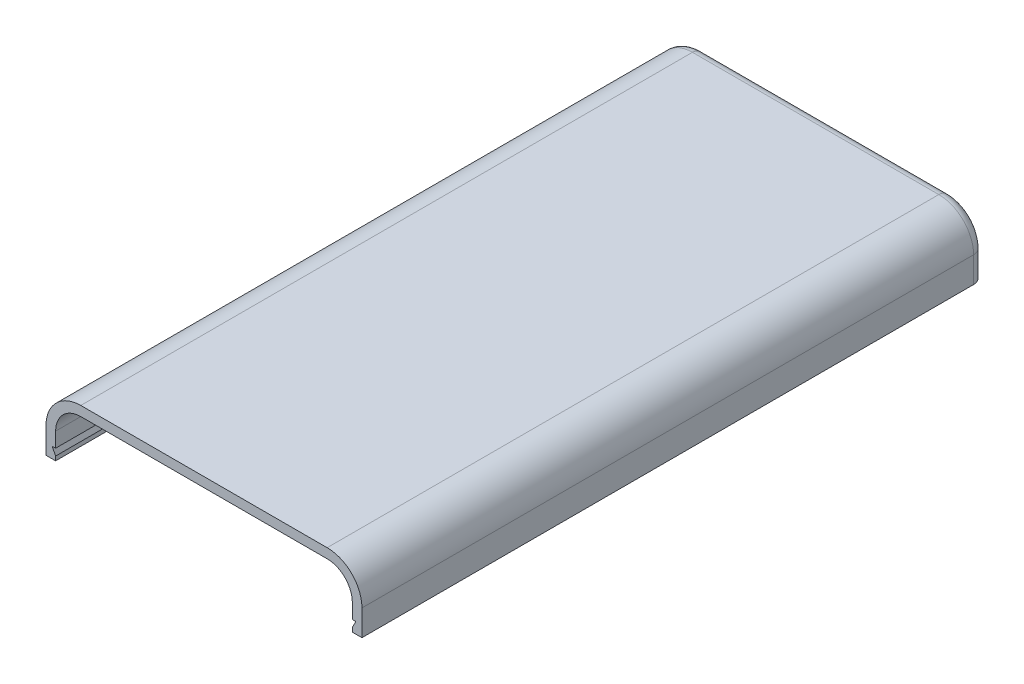
ISO-10303-21;
HEADER;
FILE_DESCRIPTION(('STEP AP214'),'2;1');
FILE_NAME('part.step','',(''),(''),'','','');
FILE_SCHEMA(('AUTOMOTIVE_DESIGN { 1 0 10303 214 1 1 1 1 }'));
ENDSEC;
DATA;
#1=APPLICATION_CONTEXT('core data for automotive mechanical design processes');
#2=APPLICATION_PROTOCOL_DEFINITION('international standard','automotive_design',2000,#1);
#3=PRODUCT_CONTEXT('',#1,'mechanical');
#4=PRODUCT('Part','Part','',(#3));
#5=PRODUCT_RELATED_PRODUCT_CATEGORY('part','',(#4));
#6=PRODUCT_DEFINITION_FORMATION('','',#4);
#7=PRODUCT_DEFINITION_CONTEXT('part definition',#1,'design');
#8=PRODUCT_DEFINITION('design','',#6,#7);
#9=PRODUCT_DEFINITION_SHAPE('','',#8);
#10=(LENGTH_UNIT() NAMED_UNIT(*) SI_UNIT(.MILLI.,.METRE.));
#11=(NAMED_UNIT(*) PLANE_ANGLE_UNIT() SI_UNIT($,.RADIAN.));
#12=(NAMED_UNIT(*) SI_UNIT($,.STERADIAN.) SOLID_ANGLE_UNIT());
#13=UNCERTAINTY_MEASURE_WITH_UNIT(LENGTH_MEASURE(1.E-05),#10,'distance_accuracy_value','');
#14=(GEOMETRIC_REPRESENTATION_CONTEXT(3) GLOBAL_UNCERTAINTY_ASSIGNED_CONTEXT((#13)) GLOBAL_UNIT_ASSIGNED_CONTEXT((#10,
#11,#12)) REPRESENTATION_CONTEXT('',''));
#15=CARTESIAN_POINT('',(0.,0.,0.));
#16=DIRECTION('',(0.,0.,1.));
#17=DIRECTION('',(1.,0.,0.));
#18=AXIS2_PLACEMENT_3D('',#15,#16,#17);
#19=CARTESIAN_POINT('',(0.,0.,116.3));
#20=DIRECTION('',(1.,0.,0.));
#21=DIRECTION('',(0.,0.,-1.));
#22=AXIS2_PLACEMENT_3D('',#19,#20,#21);
#23=PLANE('',#22);
#24=DIRECTION('',(0.,0.,-1.));
#25=VECTOR('',#24,1.);
#26=CARTESIAN_POINT('',(0.,4.81999999999995,116.3));
#27=LINE('',#26,#25);
#28=CARTESIAN_POINT('',(0.,4.81999999999995,116.3));
#29=VERTEX_POINT('',#28);
#30=CARTESIAN_POINT('',(0.,4.81999999999995,2.));
#31=VERTEX_POINT('',#30);
#32=EDGE_CURVE('E317',#29,#31,#27,.T.);
#33=ORIENTED_EDGE('',*,*,#32,.T.);
#34=DIRECTION('',(0.,-1.,0.));
#35=VECTOR('',#34,1.);
#36=CARTESIAN_POINT('',(0.,0.,2.));
#37=LINE('',#36,#35);
#38=CARTESIAN_POINT('',(0.,0.,2.));
#39=VERTEX_POINT('',#38);
#40=EDGE_CURVE('E341',#31,#39,#37,.T.);
#41=ORIENTED_EDGE('',*,*,#40,.T.);
#42=DIRECTION('',(0.,0.,-1.));
#43=VECTOR('',#42,1.);
#44=CARTESIAN_POINT('',(0.,0.,116.3));
#45=LINE('',#44,#43);
#46=CARTESIAN_POINT('',(0.,0.,116.3));
#47=VERTEX_POINT('',#46);
#48=EDGE_CURVE('E337',#47,#39,#45,.T.);
#49=ORIENTED_EDGE('',*,*,#48,.F.);
#50=DIRECTION('',(0.,-1.,0.));
#51=VECTOR('',#50,1.);
#52=CARTESIAN_POINT('',(0.,0.,116.3));
#53=LINE('',#52,#51);
#54=EDGE_CURVE('E296',#29,#47,#53,.T.);
#55=ORIENTED_EDGE('',*,*,#54,.F.);
#56=EDGE_LOOP('',(#33,#41,#49,#55));
#57=FACE_BOUND('',#56,.T.);
#58=ADVANCED_FACE('F44',(#57),#23,.F.);
#59=CARTESIAN_POINT('',(0.,0.,116.3));
#60=DIRECTION('',(0.,1.,0.));
#61=DIRECTION('',(0.,0.,1.));
#62=AXIS2_PLACEMENT_3D('',#59,#60,#61);
#63=PLANE('',#62);
#64=ORIENTED_EDGE('',*,*,#48,.T.);
#65=CARTESIAN_POINT('',(2.,0.,2.));
#66=DIRECTION('',(0.,1.,0.));
#67=DIRECTION('',(0.,0.,1.));
#68=AXIS2_PLACEMENT_3D('',#65,#66,#67);
#69=CIRCLE('',#68,2.);
#70=CARTESIAN_POINT('',(2.,0.,0.));
#71=VERTEX_POINT('',#70);
#72=EDGE_CURVE('E348',#39,#71,#69,.F.);
#73=ORIENTED_EDGE('',*,*,#72,.T.);
#74=DIRECTION('',(1.,0.,0.));
#75=VECTOR('',#74,1.);
#76=CARTESIAN_POINT('',(0.,0.,0.));
#77=LINE('',#76,#75);
#78=CARTESIAN_POINT('',(57.04,0.,0.));
#79=VERTEX_POINT('',#78);
#80=EDGE_CURVE('E295',#71,#79,#77,.T.);
#81=ORIENTED_EDGE('',*,*,#80,.T.);
#82=CARTESIAN_POINT('',(57.04,0.,2.));
#83=DIRECTION('',(0.,1.,0.));
#84=DIRECTION('',(0.,0.,1.));
#85=AXIS2_PLACEMENT_3D('',#82,#83,#84);
#86=CIRCLE('',#85,2.);
#87=CARTESIAN_POINT('',(59.04,0.,2.));
#88=VERTEX_POINT('',#87);
#89=EDGE_CURVE('E345',#79,#88,#86,.F.);
#90=ORIENTED_EDGE('',*,*,#89,.T.);
#91=DIRECTION('',(0.,0.,-1.));
#92=VECTOR('',#91,1.);
#93=CARTESIAN_POINT('',(59.04,0.,116.3));
#94=LINE('',#93,#92);
#95=CARTESIAN_POINT('',(59.04,0.,116.3));
#96=VERTEX_POINT('',#95);
#97=EDGE_CURVE('E334',#96,#88,#94,.T.);
#98=ORIENTED_EDGE('',*,*,#97,.F.);
#99=DIRECTION('',(1.,0.,0.));
#100=VECTOR('',#99,1.);
#101=CARTESIAN_POINT('',(0.,0.,116.3));
#102=LINE('',#101,#100);
#103=CARTESIAN_POINT('',(57.24,0.,116.3));
#104=VERTEX_POINT('',#103);
#105=EDGE_CURVE('E300',#104,#96,#102,.T.);
#106=ORIENTED_EDGE('',*,*,#105,.F.);
#107=DIRECTION('',(0.,0.,1.));
#108=VECTOR('',#107,1.);
#109=CARTESIAN_POINT('',(57.24,0.,-57.5429656865198));
#110=LINE('',#109,#108);
#111=CARTESIAN_POINT('',(57.24,0.,3.6));
#112=VERTEX_POINT('',#111);
#113=EDGE_CURVE('E249',#112,#104,#110,.T.);
#114=ORIENTED_EDGE('',*,*,#113,.F.);
#115=DIRECTION('',(1.,0.,0.));
#116=VECTOR('',#115,1.);
#117=CARTESIAN_POINT('',(0.,0.,3.6));
#118=LINE('',#117,#116);
#119=CARTESIAN_POINT('',(1.8,0.,3.6));
#120=VERTEX_POINT('',#119);
#121=EDGE_CURVE('E250',#120,#112,#118,.T.);
#122=ORIENTED_EDGE('',*,*,#121,.F.);
#123=DIRECTION('',(0.,0.,1.));
#124=VECTOR('',#123,1.);
#125=CARTESIAN_POINT('',(1.8,0.,-57.5429656865198));
#126=LINE('',#125,#124);
#127=CARTESIAN_POINT('',(1.8,0.,116.3));
#128=VERTEX_POINT('',#127);
#129=EDGE_CURVE('E254',#120,#128,#126,.T.);
#130=ORIENTED_EDGE('',*,*,#129,.T.);
#131=EDGE_CURVE('E301',#47,#128,#102,.T.);
#132=ORIENTED_EDGE('',*,*,#131,.F.);
#133=EDGE_LOOP('',(#64,#73,#81,#90,#98,#106,#114,#122,#130,#132));
#134=FACE_BOUND('',#133,.T.);
#135=ADVANCED_FACE('F402',(#134),#63,.F.);
#136=CARTESIAN_POINT('',(59.04,0.,116.3));
#137=DIRECTION('',(-1.,0.,0.));
#138=DIRECTION('',(0.,0.,1.));
#139=AXIS2_PLACEMENT_3D('',#136,#137,#138);
#140=PLANE('',#139);
#141=ORIENTED_EDGE('',*,*,#97,.T.);
#142=DIRECTION('',(0.,1.,0.));
#143=VECTOR('',#142,1.);
#144=CARTESIAN_POINT('',(59.04,4.81999999999995,2.));
#145=LINE('',#144,#143);
#146=CARTESIAN_POINT('',(59.04,4.81999999999995,2.));
#147=VERTEX_POINT('',#146);
#148=EDGE_CURVE('E12',#88,#147,#145,.T.);
#149=ORIENTED_EDGE('',*,*,#148,.T.);
#150=DIRECTION('',(0.,0.,-1.));
#151=VECTOR('',#150,1.);
#152=CARTESIAN_POINT('',(59.04,4.81999999999995,116.3));
#153=LINE('',#152,#151);
#154=CARTESIAN_POINT('',(59.04,4.81999999999995,116.3));
#155=VERTEX_POINT('',#154);
#156=EDGE_CURVE('E331',#155,#147,#153,.T.);
#157=ORIENTED_EDGE('',*,*,#156,.F.);
#158=DIRECTION('',(0.,1.,0.));
#159=VECTOR('',#158,1.);
#160=CARTESIAN_POINT('',(59.04,0.,116.3));
#161=LINE('',#160,#159);
#162=EDGE_CURVE('E305',#96,#155,#161,.T.);
#163=ORIENTED_EDGE('',*,*,#162,.F.);
#164=EDGE_LOOP('',(#141,#149,#157,#163));
#165=FACE_BOUND('',#164,.T.);
#166=ADVANCED_FACE('F431',(#165),#140,.F.);
#167=CARTESIAN_POINT('',(52.54,4.82,116.3));
#168=DIRECTION('',(0.,0.,-1.));
#169=DIRECTION('',(-1.,0.,0.));
#170=AXIS2_PLACEMENT_3D('',#167,#168,#169);
#171=CYLINDRICAL_SURFACE('',#170,6.5);
#172=ORIENTED_EDGE('',*,*,#156,.T.);
#173=CARTESIAN_POINT('',(52.54,4.82,2.));
#174=DIRECTION('',(0.,0.,-1.));
#175=DIRECTION('',(-1.,0.,0.));
#176=AXIS2_PLACEMENT_3D('',#173,#174,#175);
#177=CIRCLE('',#176,6.5);
#178=CARTESIAN_POINT('',(52.54,11.32,2.));
#179=VERTEX_POINT('',#178);
#180=EDGE_CURVE('E54',#147,#179,#177,.F.);
#181=ORIENTED_EDGE('',*,*,#180,.T.);
#182=DIRECTION('',(0.,0.,-1.));
#183=VECTOR('',#182,1.);
#184=CARTESIAN_POINT('',(52.54,11.32,116.3));
#185=LINE('',#184,#183);
#186=CARTESIAN_POINT('',(52.54,11.32,116.3));
#187=VERTEX_POINT('',#186);
#188=EDGE_CURVE('E328',#187,#179,#185,.T.);
#189=ORIENTED_EDGE('',*,*,#188,.F.);
#190=CARTESIAN_POINT('',(52.54,4.82,116.3));
#191=DIRECTION('',(0.,0.,1.));
#192=DIRECTION('',(1.,0.,0.));
#193=AXIS2_PLACEMENT_3D('',#190,#191,#192);
#194=CIRCLE('',#193,6.5);
#195=EDGE_CURVE('E308',#155,#187,#194,.T.);
#196=ORIENTED_EDGE('',*,*,#195,.F.);
#197=EDGE_LOOP('',(#172,#181,#189,#196));
#198=FACE_BOUND('',#197,.T.);
#199=ADVANCED_FACE('F429',(#198),#171,.T.);
#200=CARTESIAN_POINT('',(6.50000000000005,11.32,116.3));
#201=DIRECTION('',(0.,-1.,0.));
#202=DIRECTION('',(0.,0.,-1.));
#203=AXIS2_PLACEMENT_3D('',#200,#201,#202);
#204=PLANE('',#203);
#205=ORIENTED_EDGE('',*,*,#188,.T.);
#206=DIRECTION('',(-1.,0.,0.));
#207=VECTOR('',#206,1.);
#208=CARTESIAN_POINT('',(6.50000000000005,11.32,2.));
#209=LINE('',#208,#207);
#210=CARTESIAN_POINT('',(6.50000000000005,11.32,2.));
#211=VERTEX_POINT('',#210);
#212=EDGE_CURVE('E369',#179,#211,#209,.T.);
#213=ORIENTED_EDGE('',*,*,#212,.T.);
#214=DIRECTION('',(0.,0.,-1.));
#215=VECTOR('',#214,1.);
#216=CARTESIAN_POINT('',(6.50000000000005,11.32,116.3));
#217=LINE('',#216,#215);
#218=CARTESIAN_POINT('',(6.50000000000005,11.32,116.3));
#219=VERTEX_POINT('',#218);
#220=EDGE_CURVE('E324',#219,#211,#217,.T.);
#221=ORIENTED_EDGE('',*,*,#220,.F.);
#222=DIRECTION('',(-1.,0.,0.));
#223=VECTOR('',#222,1.);
#224=CARTESIAN_POINT('',(6.50000000000005,11.32,116.3));
#225=LINE('',#224,#223);
#226=EDGE_CURVE('E311',#187,#219,#225,.T.);
#227=ORIENTED_EDGE('',*,*,#226,.F.);
#228=EDGE_LOOP('',(#205,#213,#221,#227));
#229=FACE_BOUND('',#228,.T.);
#230=ADVANCED_FACE('F422',(#229),#204,.F.);
#231=CARTESIAN_POINT('',(6.5,4.82,116.3));
#232=DIRECTION('',(0.,0.,-1.));
#233=DIRECTION('',(-1.,0.,0.));
#234=AXIS2_PLACEMENT_3D('',#231,#232,#233);
#235=CYLINDRICAL_SURFACE('',#234,6.5);
#236=ORIENTED_EDGE('',*,*,#220,.T.);
#237=CARTESIAN_POINT('',(6.5,4.82,2.));
#238=DIRECTION('',(0.,0.,-1.));
#239=DIRECTION('',(-1.,0.,0.));
#240=AXIS2_PLACEMENT_3D('',#237,#238,#239);
#241=CIRCLE('',#240,6.5);
#242=EDGE_CURVE('E366',#211,#31,#241,.F.);
#243=ORIENTED_EDGE('',*,*,#242,.T.);
#244=ORIENTED_EDGE('',*,*,#32,.F.);
#245=CARTESIAN_POINT('',(6.5,4.82,116.3));
#246=DIRECTION('',(0.,0.,1.));
#247=DIRECTION('',(-1.,0.,0.));
#248=AXIS2_PLACEMENT_3D('',#245,#246,#247);
#249=CIRCLE('',#248,6.5);
#250=EDGE_CURVE('E314',#219,#29,#249,.T.);
#251=ORIENTED_EDGE('',*,*,#250,.F.);
#252=EDGE_LOOP('',(#236,#243,#244,#251));
#253=FACE_BOUND('',#252,.T.);
#254=ADVANCED_FACE('F424',(#253),#235,.T.);
#255=CARTESIAN_POINT('',(6.5,4.82,116.3));
#256=DIRECTION('',(0.,0.,-1.));
#257=DIRECTION('',(-1.,0.,0.));
#258=AXIS2_PLACEMENT_3D('',#255,#256,#257);
#259=PLANE('',#258);
#260=ORIENTED_EDGE('',*,*,#131,.T.);
#261=DIRECTION('',(0.,-1.,0.));
#262=VECTOR('',#261,1.);
#263=CARTESIAN_POINT('',(1.8,0.,116.3));
#264=LINE('',#263,#262);
#265=CARTESIAN_POINT('',(1.8,0.779999999999999,116.3));
#266=VERTEX_POINT('',#265);
#267=EDGE_CURVE('E660',#266,#128,#264,.T.);
#268=ORIENTED_EDGE('',*,*,#267,.F.);
#269=DIRECTION('',(0.458375510656831,-0.888758623716299,0.));
#270=VECTOR('',#269,1.);
#271=CARTESIAN_POINT('',(1.73956585085152,0.897177663234448,116.3));
#272=LINE('',#271,#270);
#273=CARTESIAN_POINT('',(1.145,2.05,116.3));
#274=VERTEX_POINT('',#273);
#275=EDGE_CURVE('E668',#274,#266,#272,.T.);
#276=ORIENTED_EDGE('',*,*,#275,.F.);
#277=DIRECTION('',(-1.,0.,0.));
#278=VECTOR('',#277,1.);
#279=CARTESIAN_POINT('',(0.,2.05,116.3));
#280=LINE('',#279,#278);
#281=CARTESIAN_POINT('',(1.8,2.05,116.3));
#282=VERTEX_POINT('',#281);
#283=EDGE_CURVE('E672',#282,#274,#280,.T.);
#284=ORIENTED_EDGE('',*,*,#283,.F.);
#285=CARTESIAN_POINT('',(1.8,4.81999999999996,116.3));
#286=VERTEX_POINT('',#285);
#287=EDGE_CURVE('E676',#286,#282,#264,.T.);
#288=ORIENTED_EDGE('',*,*,#287,.F.);
#289=CARTESIAN_POINT('',(6.5,4.82,116.3));
#290=DIRECTION('',(0.,0.,1.));
#291=DIRECTION('',(1.,0.,0.));
#292=AXIS2_PLACEMENT_3D('',#289,#290,#291);
#293=CIRCLE('',#292,4.7);
#294=CARTESIAN_POINT('',(6.50000000000003,9.52,116.3));
#295=VERTEX_POINT('',#294);
#296=EDGE_CURVE('E207',#295,#286,#293,.T.);
#297=ORIENTED_EDGE('',*,*,#296,.F.);
#298=DIRECTION('',(-1.,0.,0.));
#299=VECTOR('',#298,1.);
#300=CARTESIAN_POINT('',(0.,9.52,116.3));
#301=LINE('',#300,#299);
#302=CARTESIAN_POINT('',(52.54,9.52,116.3));
#303=VERTEX_POINT('',#302);
#304=EDGE_CURVE('E223',#303,#295,#301,.T.);
#305=ORIENTED_EDGE('',*,*,#304,.F.);
#306=CARTESIAN_POINT('',(52.54,4.82,116.3));
#307=DIRECTION('',(0.,0.,1.));
#308=DIRECTION('',(1.,0.,0.));
#309=AXIS2_PLACEMENT_3D('',#306,#307,#308);
#310=CIRCLE('',#309,4.7);
#311=CARTESIAN_POINT('',(57.24,4.81999999999997,116.3));
#312=VERTEX_POINT('',#311);
#313=EDGE_CURVE('E216',#312,#303,#310,.T.);
#314=ORIENTED_EDGE('',*,*,#313,.F.);
#315=DIRECTION('',(0.,1.,0.));
#316=VECTOR('',#315,1.);
#317=CARTESIAN_POINT('',(57.24,0.,116.3));
#318=LINE('',#317,#316);
#319=CARTESIAN_POINT('',(57.24,2.05000000000001,116.3));
#320=VERTEX_POINT('',#319);
#321=EDGE_CURVE('E219',#320,#312,#318,.T.);
#322=ORIENTED_EDGE('',*,*,#321,.F.);
#323=DIRECTION('',(1.,0.,0.));
#324=VECTOR('',#323,1.);
#325=CARTESIAN_POINT('',(0.,2.05000000000001,116.3));
#326=LINE('',#325,#324);
#327=CARTESIAN_POINT('',(57.895,2.05000000000001,116.3));
#328=VERTEX_POINT('',#327);
#329=EDGE_CURVE('E237',#320,#328,#326,.T.);
#330=ORIENTED_EDGE('',*,*,#329,.T.);
#331=DIRECTION('',(-0.458375510656831,-0.888758623716299,0.));
#332=VECTOR('',#331,1.);
#333=CARTESIAN_POINT('',(44.895651407373,-23.154843836086,116.3));
#334=LINE('',#333,#332);
#335=CARTESIAN_POINT('',(57.24,0.779999999999979,116.3));
#336=VERTEX_POINT('',#335);
#337=EDGE_CURVE('E276',#328,#336,#334,.T.);
#338=ORIENTED_EDGE('',*,*,#337,.T.);
#339=EDGE_CURVE('E653',#104,#336,#318,.T.);
#340=ORIENTED_EDGE('',*,*,#339,.F.);
#341=ORIENTED_EDGE('',*,*,#105,.T.);
#342=ORIENTED_EDGE('',*,*,#162,.T.);
#343=ORIENTED_EDGE('',*,*,#195,.T.);
#344=ORIENTED_EDGE('',*,*,#226,.T.);
#345=ORIENTED_EDGE('',*,*,#250,.T.);
#346=ORIENTED_EDGE('',*,*,#54,.T.);
#347=EDGE_LOOP('',(#260,#268,#276,#284,#288,#297,#305,#314,#322,#330,#338,#340,#341,#342,#343,
#344,#345,#346));
#348=FACE_BOUND('',#347,.T.);
#349=ADVANCED_FACE('F426',(#348),#259,.F.);
#350=CARTESIAN_POINT('',(6.5,4.82,0.));
#351=DIRECTION('',(0.,0.,-1.));
#352=DIRECTION('',(-1.,0.,0.));
#353=AXIS2_PLACEMENT_3D('',#350,#351,#352);
#354=PLANE('',#353);
#355=ORIENTED_EDGE('',*,*,#80,.F.);
#356=DIRECTION('',(0.,-1.,0.));
#357=VECTOR('',#356,1.);
#358=CARTESIAN_POINT('',(2.,4.81999999999995,0.));
#359=LINE('',#358,#357);
#360=CARTESIAN_POINT('',(2.,4.81999999999995,0.));
#361=VERTEX_POINT('',#360);
#362=EDGE_CURVE('E363',#71,#361,#359,.F.);
#363=ORIENTED_EDGE('',*,*,#362,.T.);
#364=CARTESIAN_POINT('',(6.5,4.82,0.));
#365=DIRECTION('',(0.,0.,-1.));
#366=DIRECTION('',(-1.,0.,0.));
#367=AXIS2_PLACEMENT_3D('',#364,#365,#366);
#368=CIRCLE('',#367,4.5);
#369=CARTESIAN_POINT('',(6.50000000000003,9.32,0.));
#370=VERTEX_POINT('',#369);
#371=EDGE_CURVE('E360',#361,#370,#368,.T.);
#372=ORIENTED_EDGE('',*,*,#371,.T.);
#373=DIRECTION('',(-1.,0.,0.));
#374=VECTOR('',#373,1.);
#375=CARTESIAN_POINT('',(52.54,9.32,0.));
#376=LINE('',#375,#374);
#377=CARTESIAN_POINT('',(52.54,9.32,0.));
#378=VERTEX_POINT('',#377);
#379=EDGE_CURVE('E357',#370,#378,#376,.F.);
#380=ORIENTED_EDGE('',*,*,#379,.T.);
#381=CARTESIAN_POINT('',(52.54,4.82,0.));
#382=DIRECTION('',(0.,0.,-1.));
#383=DIRECTION('',(-1.,0.,0.));
#384=AXIS2_PLACEMENT_3D('',#381,#382,#383);
#385=CIRCLE('',#384,4.5);
#386=CARTESIAN_POINT('',(57.04,4.81999999999997,0.));
#387=VERTEX_POINT('',#386);
#388=EDGE_CURVE('E354',#378,#387,#385,.T.);
#389=ORIENTED_EDGE('',*,*,#388,.T.);
#390=DIRECTION('',(0.,1.,0.));
#391=VECTOR('',#390,1.);
#392=CARTESIAN_POINT('',(57.04,0.,0.));
#393=LINE('',#392,#391);
#394=EDGE_CURVE('E351',#387,#79,#393,.F.);
#395=ORIENTED_EDGE('',*,*,#394,.T.);
#396=EDGE_LOOP('',(#355,#363,#372,#380,#389,#395));
#397=FACE_BOUND('',#396,.T.);
#398=ADVANCED_FACE('F399',(#397),#354,.T.);
#399=CARTESIAN_POINT('',(6.5,4.82,3.6));
#400=DIRECTION('',(0.,0.,-1.));
#401=DIRECTION('',(-1.,0.,0.));
#402=AXIS2_PLACEMENT_3D('',#399,#400,#401);
#403=PLANE('',#402);
#404=DIRECTION('',(-1.,0.,0.));
#405=VECTOR('',#404,1.);
#406=CARTESIAN_POINT('',(0.,9.52,3.6));
#407=LINE('',#406,#405);
#408=CARTESIAN_POINT('',(52.54,9.52,3.6));
#409=VERTEX_POINT('',#408);
#410=CARTESIAN_POINT('',(6.50000000000003,9.52,3.6));
#411=VERTEX_POINT('',#410);
#412=EDGE_CURVE('E213',#409,#411,#407,.T.);
#413=ORIENTED_EDGE('',*,*,#412,.T.);
#414=CARTESIAN_POINT('',(6.5,4.82,3.6));
#415=DIRECTION('',(0.,0.,-1.));
#416=DIRECTION('',(-1.,0.,0.));
#417=AXIS2_PLACEMENT_3D('',#414,#415,#416);
#418=CIRCLE('',#417,4.7);
#419=CARTESIAN_POINT('',(1.8,4.81999999999996,3.6));
#420=VERTEX_POINT('',#419);
#421=EDGE_CURVE('E204',#411,#420,#418,.F.);
#422=ORIENTED_EDGE('',*,*,#421,.T.);
#423=DIRECTION('',(0.,-1.,0.));
#424=VECTOR('',#423,1.);
#425=CARTESIAN_POINT('',(1.8,0.,3.6));
#426=LINE('',#425,#424);
#427=CARTESIAN_POINT('',(1.8,2.05,3.6));
#428=VERTEX_POINT('',#427);
#429=EDGE_CURVE('E190',#420,#428,#426,.T.);
#430=ORIENTED_EDGE('',*,*,#429,.T.);
#431=DIRECTION('',(-1.,0.,0.));
#432=VECTOR('',#431,1.);
#433=CARTESIAN_POINT('',(0.,2.05,3.6));
#434=LINE('',#433,#432);
#435=CARTESIAN_POINT('',(1.145,2.05,3.6));
#436=VERTEX_POINT('',#435);
#437=EDGE_CURVE('E265',#428,#436,#434,.T.);
#438=ORIENTED_EDGE('',*,*,#437,.T.);
#439=DIRECTION('',(0.458375510656831,-0.888758623716299,0.));
#440=VECTOR('',#439,1.);
#441=CARTESIAN_POINT('',(1.73956585085152,0.897177663234448,3.6));
#442=LINE('',#441,#440);
#443=CARTESIAN_POINT('',(1.8,0.779999999999999,3.6));
#444=VERTEX_POINT('',#443);
#445=EDGE_CURVE('E260',#436,#444,#442,.T.);
#446=ORIENTED_EDGE('',*,*,#445,.T.);
#447=DIRECTION('',(0.,-1.,0.));
#448=VECTOR('',#447,1.);
#449=CARTESIAN_POINT('',(1.8,0.,3.6));
#450=LINE('',#449,#448);
#451=EDGE_CURVE('E255',#444,#120,#450,.T.);
#452=ORIENTED_EDGE('',*,*,#451,.T.);
#453=ORIENTED_EDGE('',*,*,#121,.T.);
#454=DIRECTION('',(0.,1.,0.));
#455=VECTOR('',#454,1.);
#456=CARTESIAN_POINT('',(57.24,0.,3.6));
#457=LINE('',#456,#455);
#458=CARTESIAN_POINT('',(57.24,0.779999999999979,3.6));
#459=VERTEX_POINT('',#458);
#460=EDGE_CURVE('E244',#112,#459,#457,.T.);
#461=ORIENTED_EDGE('',*,*,#460,.T.);
#462=DIRECTION('',(-0.458375510656831,-0.888758623716299,0.));
#463=VECTOR('',#462,1.);
#464=CARTESIAN_POINT('',(44.895651407373,-23.154843836086,3.6));
#465=LINE('',#464,#463);
#466=CARTESIAN_POINT('',(57.895,2.05000000000001,3.6));
#467=VERTEX_POINT('',#466);
#468=EDGE_CURVE('E241',#467,#459,#465,.T.);
#469=ORIENTED_EDGE('',*,*,#468,.F.);
#470=DIRECTION('',(1.,0.,0.));
#471=VECTOR('',#470,1.);
#472=CARTESIAN_POINT('',(0.,2.05000000000001,3.6));
#473=LINE('',#472,#471);
#474=CARTESIAN_POINT('',(57.24,2.05000000000001,3.6));
#475=VERTEX_POINT('',#474);
#476=EDGE_CURVE('E238',#475,#467,#473,.T.);
#477=ORIENTED_EDGE('',*,*,#476,.F.);
#478=DIRECTION('',(0.,1.,0.));
#479=VECTOR('',#478,1.);
#480=CARTESIAN_POINT('',(57.24,0.,3.6));
#481=LINE('',#480,#479);
#482=CARTESIAN_POINT('',(57.24,4.81999999999997,3.6));
#483=VERTEX_POINT('',#482);
#484=EDGE_CURVE('E233',#475,#483,#481,.T.);
#485=ORIENTED_EDGE('',*,*,#484,.T.);
#486=CARTESIAN_POINT('',(52.54,4.82,3.6));
#487=DIRECTION('',(0.,0.,-1.));
#488=DIRECTION('',(-1.,0.,0.));
#489=AXIS2_PLACEMENT_3D('',#486,#487,#488);
#490=CIRCLE('',#489,4.7);
#491=EDGE_CURVE('E229',#483,#409,#490,.F.);
#492=ORIENTED_EDGE('',*,*,#491,.T.);
#493=EDGE_LOOP('',(#413,#422,#430,#438,#446,#452,#453,#461,#469,#477,#485,#492));
#494=FACE_BOUND('',#493,.T.);
#495=ADVANCED_FACE('F211',(#494),#403,.F.);
#496=CARTESIAN_POINT('',(6.5,4.82,-57.5429656865198));
#497=DIRECTION('',(0.,0.,1.));
#498=DIRECTION('',(1.,0.,0.));
#499=AXIS2_PLACEMENT_3D('',#496,#497,#498);
#500=CYLINDRICAL_SURFACE('',#499,4.7);
#501=DIRECTION('',(0.,0.,1.));
#502=VECTOR('',#501,1.);
#503=CARTESIAN_POINT('',(6.50000000000003,9.52,-57.5429656865198));
#504=LINE('',#503,#502);
#505=EDGE_CURVE('E227',#411,#295,#504,.T.);
#506=ORIENTED_EDGE('',*,*,#505,.T.);
#507=ORIENTED_EDGE('',*,*,#296,.T.);
#508=DIRECTION('',(0.,0.,1.));
#509=VECTOR('',#508,1.);
#510=CARTESIAN_POINT('',(1.8,4.81999999999996,-57.5429656865198));
#511=LINE('',#510,#509);
#512=EDGE_CURVE('E194',#420,#286,#511,.T.);
#513=ORIENTED_EDGE('',*,*,#512,.F.);
#514=ORIENTED_EDGE('',*,*,#421,.F.);
#515=EDGE_LOOP('',(#506,#507,#513,#514));
#516=FACE_BOUND('',#515,.T.);
#517=ADVANCED_FACE('F203',(#516),#500,.F.);
#518=CARTESIAN_POINT('',(1.8,0.,-57.5429656865198));
#519=DIRECTION('',(-1.,0.,0.));
#520=DIRECTION('',(0.,0.,1.));
#521=AXIS2_PLACEMENT_3D('',#518,#519,#520);
#522=PLANE('',#521);
#523=ORIENTED_EDGE('',*,*,#512,.T.);
#524=ORIENTED_EDGE('',*,*,#287,.T.);
#525=DIRECTION('',(0.,0.,1.));
#526=VECTOR('',#525,1.);
#527=CARTESIAN_POINT('',(1.8,2.05,-57.5429656865198));
#528=LINE('',#527,#526);
#529=EDGE_CURVE('E196',#428,#282,#528,.T.);
#530=ORIENTED_EDGE('',*,*,#529,.F.);
#531=ORIENTED_EDGE('',*,*,#429,.F.);
#532=EDGE_LOOP('',(#523,#524,#530,#531));
#533=FACE_BOUND('',#532,.T.);
#534=ADVANCED_FACE('F192',(#533),#522,.F.);
#535=CARTESIAN_POINT('',(0.,2.05,-57.5429656865198));
#536=DIRECTION('',(0.,1.,0.));
#537=DIRECTION('',(0.,0.,1.));
#538=AXIS2_PLACEMENT_3D('',#535,#536,#537);
#539=PLANE('',#538);
#540=ORIENTED_EDGE('',*,*,#529,.T.);
#541=ORIENTED_EDGE('',*,*,#283,.T.);
#542=DIRECTION('',(0.,0.,1.));
#543=VECTOR('',#542,1.);
#544=CARTESIAN_POINT('',(1.145,2.05,-57.5429656865198));
#545=LINE('',#544,#543);
#546=EDGE_CURVE('E264',#436,#274,#545,.T.);
#547=ORIENTED_EDGE('',*,*,#546,.F.);
#548=ORIENTED_EDGE('',*,*,#437,.F.);
#549=EDGE_LOOP('',(#540,#541,#547,#548));
#550=FACE_BOUND('',#549,.T.);
#551=ADVANCED_FACE('F488',(#550),#539,.F.);
#552=CARTESIAN_POINT('',(1.73956585085152,0.897177663234448,-57.5429656865198));
#553=DIRECTION('',(-0.888758623716298,-0.458375510656831,0.));
#554=DIRECTION('',(0.458375510656831,-0.888758623716299,0.));
#555=AXIS2_PLACEMENT_3D('',#552,#553,#554);
#556=PLANE('',#555);
#557=ORIENTED_EDGE('',*,*,#546,.T.);
#558=ORIENTED_EDGE('',*,*,#275,.T.);
#559=DIRECTION('',(0.,0.,1.));
#560=VECTOR('',#559,1.);
#561=CARTESIAN_POINT('',(1.8,0.779999999999999,-57.5429656865198));
#562=LINE('',#561,#560);
#563=EDGE_CURVE('E259',#444,#266,#562,.T.);
#564=ORIENTED_EDGE('',*,*,#563,.F.);
#565=ORIENTED_EDGE('',*,*,#445,.F.);
#566=EDGE_LOOP('',(#557,#558,#564,#565));
#567=FACE_BOUND('',#566,.T.);
#568=ADVANCED_FACE('F484',(#567),#556,.F.);
#569=ORIENTED_EDGE('',*,*,#563,.T.);
#570=ORIENTED_EDGE('',*,*,#267,.T.);
#571=ORIENTED_EDGE('',*,*,#129,.F.);
#572=ORIENTED_EDGE('',*,*,#451,.F.);
#573=EDGE_LOOP('',(#569,#570,#571,#572));
#574=FACE_BOUND('',#573,.T.);
#575=ADVANCED_FACE('F481',(#574),#522,.F.);
#576=CARTESIAN_POINT('',(57.24,0.,-57.5429656865198));
#577=DIRECTION('',(1.,0.,0.));
#578=DIRECTION('',(0.,0.,-1.));
#579=AXIS2_PLACEMENT_3D('',#576,#577,#578);
#580=PLANE('',#579);
#581=ORIENTED_EDGE('',*,*,#113,.T.);
#582=ORIENTED_EDGE('',*,*,#339,.T.);
#583=DIRECTION('',(0.,0.,1.));
#584=VECTOR('',#583,1.);
#585=CARTESIAN_POINT('',(57.24,0.779999999999979,-57.5429656865198));
#586=LINE('',#585,#584);
#587=EDGE_CURVE('E248',#459,#336,#586,.T.);
#588=ORIENTED_EDGE('',*,*,#587,.F.);
#589=ORIENTED_EDGE('',*,*,#460,.F.);
#590=EDGE_LOOP('',(#581,#582,#588,#589));
#591=FACE_BOUND('',#590,.T.);
#592=ADVANCED_FACE('F473',(#591),#580,.F.);
#593=CARTESIAN_POINT('',(44.895651407373,-23.154843836086,-57.5429656865198));
#594=DIRECTION('',(-0.888758623716299,0.458375510656831,0.));
#595=DIRECTION('',(-0.458375510656831,-0.888758623716299,0.));
#596=AXIS2_PLACEMENT_3D('',#593,#594,#595);
#597=PLANE('',#596);
#598=ORIENTED_EDGE('',*,*,#468,.T.);
#599=ORIENTED_EDGE('',*,*,#587,.T.);
#600=ORIENTED_EDGE('',*,*,#337,.F.);
#601=DIRECTION('',(0.,0.,1.));
#602=VECTOR('',#601,1.);
#603=CARTESIAN_POINT('',(57.895,2.05000000000001,-57.5429656865198));
#604=LINE('',#603,#602);
#605=EDGE_CURVE('E277',#467,#328,#604,.T.);
#606=ORIENTED_EDGE('',*,*,#605,.F.);
#607=EDGE_LOOP('',(#598,#599,#600,#606));
#608=FACE_BOUND('',#607,.T.);
#609=ADVANCED_FACE('F476',(#608),#597,.T.);
#610=CARTESIAN_POINT('',(0.,2.05000000000001,-57.5429656865198));
#611=DIRECTION('',(0.,-1.,0.));
#612=DIRECTION('',(0.,0.,-1.));
#613=AXIS2_PLACEMENT_3D('',#610,#611,#612);
#614=PLANE('',#613);
#615=ORIENTED_EDGE('',*,*,#476,.T.);
#616=ORIENTED_EDGE('',*,*,#605,.T.);
#617=ORIENTED_EDGE('',*,*,#329,.F.);
#618=DIRECTION('',(0.,0.,1.));
#619=VECTOR('',#618,1.);
#620=CARTESIAN_POINT('',(57.24,2.05000000000001,-57.5429656865198));
#621=LINE('',#620,#619);
#622=EDGE_CURVE('E273',#475,#320,#621,.T.);
#623=ORIENTED_EDGE('',*,*,#622,.F.);
#624=EDGE_LOOP('',(#615,#616,#617,#623));
#625=FACE_BOUND('',#624,.T.);
#626=ADVANCED_FACE('F471',(#625),#614,.T.);
#627=ORIENTED_EDGE('',*,*,#622,.T.);
#628=ORIENTED_EDGE('',*,*,#321,.T.);
#629=DIRECTION('',(0.,0.,1.));
#630=VECTOR('',#629,1.);
#631=CARTESIAN_POINT('',(57.24,4.81999999999997,-57.5429656865198));
#632=LINE('',#631,#630);
#633=EDGE_CURVE('E232',#483,#312,#632,.T.);
#634=ORIENTED_EDGE('',*,*,#633,.F.);
#635=ORIENTED_EDGE('',*,*,#484,.F.);
#636=EDGE_LOOP('',(#627,#628,#634,#635));
#637=FACE_BOUND('',#636,.T.);
#638=ADVANCED_FACE('F465',(#637),#580,.F.);
#639=CARTESIAN_POINT('',(52.54,4.82,-57.5429656865198));
#640=DIRECTION('',(0.,0.,1.));
#641=DIRECTION('',(1.,0.,0.));
#642=AXIS2_PLACEMENT_3D('',#639,#640,#641);
#643=CYLINDRICAL_SURFACE('',#642,4.7);
#644=ORIENTED_EDGE('',*,*,#633,.T.);
#645=ORIENTED_EDGE('',*,*,#313,.T.);
#646=DIRECTION('',(0.,0.,1.));
#647=VECTOR('',#646,1.);
#648=CARTESIAN_POINT('',(52.54,9.52,-57.5429656865198));
#649=LINE('',#648,#647);
#650=EDGE_CURVE('E228',#409,#303,#649,.T.);
#651=ORIENTED_EDGE('',*,*,#650,.F.);
#652=ORIENTED_EDGE('',*,*,#491,.F.);
#653=EDGE_LOOP('',(#644,#645,#651,#652));
#654=FACE_BOUND('',#653,.T.);
#655=ADVANCED_FACE('F459',(#654),#643,.F.);
#656=CARTESIAN_POINT('',(0.,9.52,-57.5429656865198));
#657=DIRECTION('',(0.,1.,0.));
#658=DIRECTION('',(0.,0.,1.));
#659=AXIS2_PLACEMENT_3D('',#656,#657,#658);
#660=PLANE('',#659);
#661=ORIENTED_EDGE('',*,*,#650,.T.);
#662=ORIENTED_EDGE('',*,*,#304,.T.);
#663=ORIENTED_EDGE('',*,*,#505,.F.);
#664=ORIENTED_EDGE('',*,*,#412,.F.);
#665=EDGE_LOOP('',(#661,#662,#663,#664));
#666=FACE_BOUND('',#665,.T.);
#667=ADVANCED_FACE('F455',(#666),#660,.F.);
#668=CARTESIAN_POINT('',(57.04,0.,2.));
#669=DIRECTION('',(0.,-1.,0.));
#670=DIRECTION('',(0.,0.,-1.));
#671=AXIS2_PLACEMENT_3D('',#668,#669,#670);
#672=CYLINDRICAL_SURFACE('',#671,2.);
#673=ORIENTED_EDGE('',*,*,#89,.F.);
#674=ORIENTED_EDGE('',*,*,#394,.F.);
#675=CARTESIAN_POINT('',(57.04,4.81999999999995,2.));
#676=DIRECTION('',(0.,1.,0.));
#677=DIRECTION('',(0.,0.,1.));
#678=AXIS2_PLACEMENT_3D('',#675,#676,#677);
#679=CIRCLE('',#678,2.);
#680=EDGE_CURVE('E48',#147,#387,#679,.T.);
#681=ORIENTED_EDGE('',*,*,#680,.F.);
#682=ORIENTED_EDGE('',*,*,#148,.F.);
#683=EDGE_LOOP('',(#673,#674,#681,#682));
#684=FACE_BOUND('',#683,.T.);
#685=ADVANCED_FACE('F46',(#684),#672,.T.);
#686=CARTESIAN_POINT('',(52.54,4.82,2.));
#687=DIRECTION('',(0.,0.,-1.));
#688=DIRECTION('',(-1.,0.,0.));
#689=AXIS2_PLACEMENT_3D('',#686,#687,#688);
#690=TOROIDAL_SURFACE('',#689,4.5,2.);
#691=ORIENTED_EDGE('',*,*,#680,.T.);
#692=ORIENTED_EDGE('',*,*,#388,.F.);
#693=CARTESIAN_POINT('',(52.54,9.32,2.));
#694=DIRECTION('',(-1.,0.,0.));
#695=DIRECTION('',(0.,-1.,0.));
#696=AXIS2_PLACEMENT_3D('',#693,#694,#695);
#697=CIRCLE('',#696,2.);
#698=EDGE_CURVE('E381',#179,#378,#697,.T.);
#699=ORIENTED_EDGE('',*,*,#698,.F.);
#700=ORIENTED_EDGE('',*,*,#180,.F.);
#701=EDGE_LOOP('',(#691,#692,#699,#700));
#702=FACE_BOUND('',#701,.T.);
#703=ADVANCED_FACE('F393',(#702),#690,.T.);
#704=CARTESIAN_POINT('',(6.50000000000005,9.32,2.));
#705=DIRECTION('',(1.,0.,0.));
#706=DIRECTION('',(0.,0.,-1.));
#707=AXIS2_PLACEMENT_3D('',#704,#705,#706);
#708=CYLINDRICAL_SURFACE('',#707,2.);
#709=ORIENTED_EDGE('',*,*,#698,.T.);
#710=ORIENTED_EDGE('',*,*,#379,.F.);
#711=CARTESIAN_POINT('',(6.50000000000005,9.32,2.));
#712=DIRECTION('',(-1.,0.,0.));
#713=DIRECTION('',(0.,0.,1.));
#714=AXIS2_PLACEMENT_3D('',#711,#712,#713);
#715=CIRCLE('',#714,2.);
#716=EDGE_CURVE('E378',#211,#370,#715,.T.);
#717=ORIENTED_EDGE('',*,*,#716,.F.);
#718=ORIENTED_EDGE('',*,*,#212,.F.);
#719=EDGE_LOOP('',(#709,#710,#717,#718));
#720=FACE_BOUND('',#719,.T.);
#721=ADVANCED_FACE('F419',(#720),#708,.T.);
#722=CARTESIAN_POINT('',(6.5,4.82,2.));
#723=DIRECTION('',(0.,0.,-1.));
#724=DIRECTION('',(-1.,0.,0.));
#725=AXIS2_PLACEMENT_3D('',#722,#723,#724);
#726=TOROIDAL_SURFACE('',#725,4.5,2.);
#727=ORIENTED_EDGE('',*,*,#716,.T.);
#728=ORIENTED_EDGE('',*,*,#371,.F.);
#729=CARTESIAN_POINT('',(2.,4.81999999999997,2.));
#730=DIRECTION('',(0.,-1.,0.));
#731=DIRECTION('',(1.,0.,0.));
#732=AXIS2_PLACEMENT_3D('',#729,#730,#731);
#733=CIRCLE('',#732,2.);
#734=EDGE_CURVE('E374',#31,#361,#733,.T.);
#735=ORIENTED_EDGE('',*,*,#734,.F.);
#736=ORIENTED_EDGE('',*,*,#242,.F.);
#737=EDGE_LOOP('',(#727,#728,#735,#736));
#738=FACE_BOUND('',#737,.T.);
#739=ADVANCED_FACE('F417',(#738),#726,.T.);
#740=CARTESIAN_POINT('',(2.,0.,2.));
#741=DIRECTION('',(0.,1.,0.));
#742=DIRECTION('',(0.,0.,1.));
#743=AXIS2_PLACEMENT_3D('',#740,#741,#742);
#744=CYLINDRICAL_SURFACE('',#743,2.);
#745=ORIENTED_EDGE('',*,*,#734,.T.);
#746=ORIENTED_EDGE('',*,*,#362,.F.);
#747=ORIENTED_EDGE('',*,*,#72,.F.);
#748=ORIENTED_EDGE('',*,*,#40,.F.);
#749=EDGE_LOOP('',(#745,#746,#747,#748));
#750=FACE_BOUND('',#749,.T.);
#751=ADVANCED_FACE('F407',(#750),#744,.T.);
#752=CLOSED_SHELL('',(#58,#135,#166,#199,#230,#254,#349,#398,#495,#517,#534,#551,#568,#575,#592,
#609,#626,#638,#655,#667,#685,#703,#721,#739,#751));
#753=MANIFOLD_SOLID_BREP('B2',#752);
#754=ADVANCED_BREP_SHAPE_REPRESENTATION('',(#18,#753),#14);
#755=SHAPE_DEFINITION_REPRESENTATION(#9,#754);
ENDSEC;
END-ISO-10303-21;
